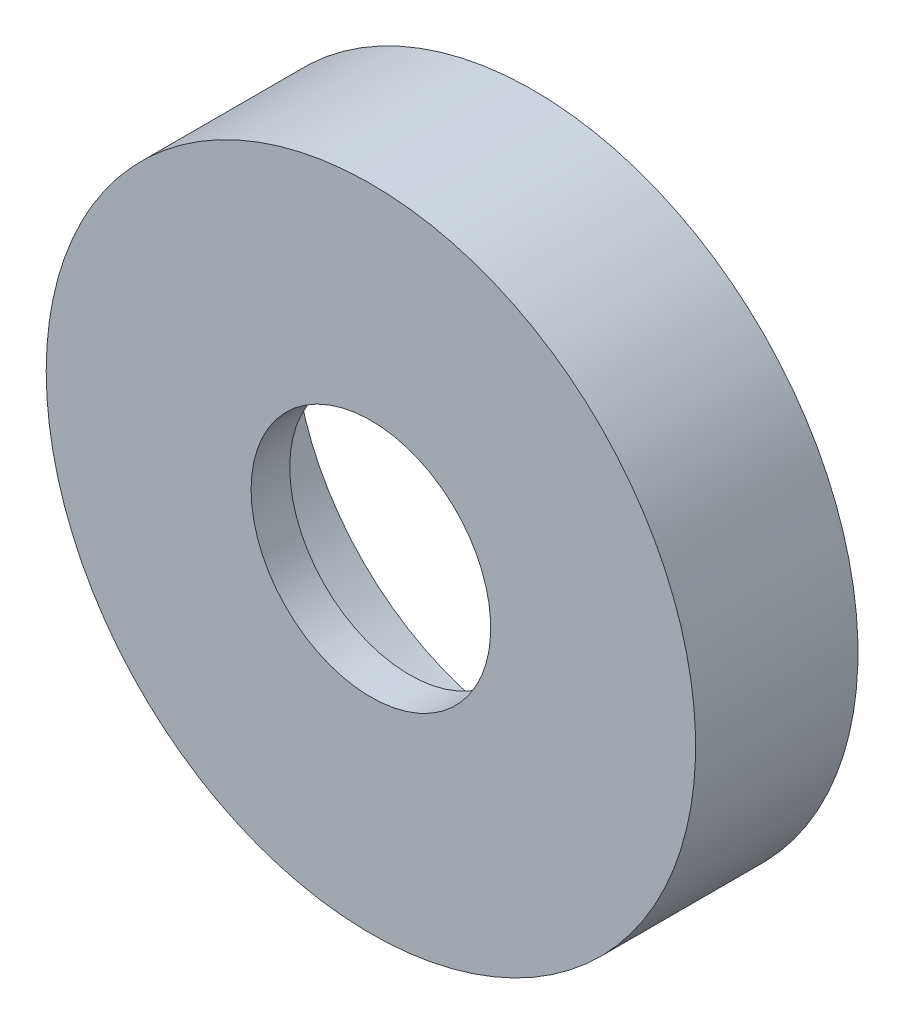
ISO-10303-21;
HEADER;
FILE_DESCRIPTION(('STEP AP214'),'2;1');
FILE_NAME('part.step','',(''),(''),'','','');
FILE_SCHEMA(('AUTOMOTIVE_DESIGN { 1 0 10303 214 1 1 1 1 }'));
ENDSEC;
DATA;
#1=APPLICATION_CONTEXT('core data for automotive mechanical design processes');
#2=APPLICATION_PROTOCOL_DEFINITION('international standard','automotive_design',2000,#1);
#3=PRODUCT_CONTEXT('',#1,'mechanical');
#4=PRODUCT('Part','Part','',(#3));
#5=PRODUCT_RELATED_PRODUCT_CATEGORY('part','',(#4));
#6=PRODUCT_DEFINITION_FORMATION('','',#4);
#7=PRODUCT_DEFINITION_CONTEXT('part definition',#1,'design');
#8=PRODUCT_DEFINITION('design','',#6,#7);
#9=PRODUCT_DEFINITION_SHAPE('','',#8);
#10=(LENGTH_UNIT() NAMED_UNIT(*) SI_UNIT(.MILLI.,.METRE.));
#11=(NAMED_UNIT(*) PLANE_ANGLE_UNIT() SI_UNIT($,.RADIAN.));
#12=(NAMED_UNIT(*) SI_UNIT($,.STERADIAN.) SOLID_ANGLE_UNIT());
#13=UNCERTAINTY_MEASURE_WITH_UNIT(LENGTH_MEASURE(1.E-05),#10,'distance_accuracy_value','');
#14=(GEOMETRIC_REPRESENTATION_CONTEXT(3) GLOBAL_UNCERTAINTY_ASSIGNED_CONTEXT((#13)) GLOBAL_UNIT_ASSIGNED_CONTEXT((#10,
#11,#12)) REPRESENTATION_CONTEXT('',''));
#15=CARTESIAN_POINT('',(0.,0.,0.));
#16=DIRECTION('',(0.,0.,1.));
#17=DIRECTION('',(1.,0.,0.));
#18=AXIS2_PLACEMENT_3D('',#15,#16,#17);
#19=CARTESIAN_POINT('',(0.,0.,21.));
#20=DIRECTION('',(0.,0.,-1.));
#21=DIRECTION('',(-1.,0.,0.));
#22=AXIS2_PLACEMENT_3D('',#19,#20,#21);
#23=CYLINDRICAL_SURFACE('',#22,42.);
#24=CARTESIAN_POINT('',(0.,0.,21.));
#25=DIRECTION('',(0.,0.,1.));
#26=DIRECTION('',(1.,0.,0.));
#27=AXIS2_PLACEMENT_3D('',#24,#25,#26);
#28=CIRCLE('',#27,42.);
#29=CARTESIAN_POINT('',(-42.,0.,21.));
#30=VERTEX_POINT('',#29);
#31=EDGE_CURVE('E10',#30,#30,#28,.T.);
#32=CARTESIAN_POINT('',(0.,0.,0.));
#33=DIRECTION('',(0.,0.,1.));
#34=DIRECTION('',(1.,0.,0.));
#35=AXIS2_PLACEMENT_3D('',#32,#33,#34);
#36=CIRCLE('',#35,42.);
#37=CARTESIAN_POINT('',(-42.,0.,0.));
#38=VERTEX_POINT('',#37);
#39=EDGE_CURVE('E32',#38,#38,#36,.T.);
#40=CARTESIAN_POINT('',(-42.,0.,21.));
#41=CARTESIAN_POINT('',(-42.,0.,20.78125));
#42=CARTESIAN_POINT('',(-42.,0.,20.5625));
#43=CARTESIAN_POINT('',(-42.,0.,20.125));
#44=CARTESIAN_POINT('',(-42.,0.,19.90625));
#45=CARTESIAN_POINT('',(-42.,0.,19.46875));
#46=CARTESIAN_POINT('',(-42.,0.,19.25));
#47=CARTESIAN_POINT('',(-42.,0.,18.8125));
#48=CARTESIAN_POINT('',(-42.,0.,18.59375));
#49=CARTESIAN_POINT('',(-42.,0.,18.15625));
#50=CARTESIAN_POINT('',(-42.,0.,17.9375));
#51=CARTESIAN_POINT('',(-42.,0.,17.5));
#52=CARTESIAN_POINT('',(-42.,0.,17.28125));
#53=CARTESIAN_POINT('',(-42.,0.,16.84375));
#54=CARTESIAN_POINT('',(-42.,0.,16.625));
#55=CARTESIAN_POINT('',(-42.,0.,16.1875));
#56=CARTESIAN_POINT('',(-42.,0.,15.96875));
#57=CARTESIAN_POINT('',(-42.,0.,15.53125));
#58=CARTESIAN_POINT('',(-42.,0.,15.3125));
#59=CARTESIAN_POINT('',(-42.,0.,14.875));
#60=CARTESIAN_POINT('',(-42.,0.,14.65625));
#61=CARTESIAN_POINT('',(-42.,0.,14.21875));
#62=CARTESIAN_POINT('',(-42.,0.,14.));
#63=CARTESIAN_POINT('',(-42.,0.,13.5625));
#64=CARTESIAN_POINT('',(-42.,0.,13.34375));
#65=CARTESIAN_POINT('',(-42.,0.,12.90625));
#66=CARTESIAN_POINT('',(-42.,0.,12.6875));
#67=CARTESIAN_POINT('',(-42.,0.,12.25));
#68=CARTESIAN_POINT('',(-42.,0.,12.03125));
#69=CARTESIAN_POINT('',(-42.,0.,11.59375));
#70=CARTESIAN_POINT('',(-42.,0.,11.375));
#71=CARTESIAN_POINT('',(-42.,0.,10.9375));
#72=CARTESIAN_POINT('',(-42.,0.,10.71875));
#73=CARTESIAN_POINT('',(-42.,0.,10.28125));
#74=CARTESIAN_POINT('',(-42.,0.,10.0625));
#75=CARTESIAN_POINT('',(-42.,0.,9.625));
#76=CARTESIAN_POINT('',(-42.,0.,9.40625));
#77=CARTESIAN_POINT('',(-42.,0.,8.96875));
#78=CARTESIAN_POINT('',(-42.,0.,8.75));
#79=CARTESIAN_POINT('',(-42.,0.,8.3125));
#80=CARTESIAN_POINT('',(-42.,0.,8.09375));
#81=CARTESIAN_POINT('',(-42.,0.,7.65625));
#82=CARTESIAN_POINT('',(-42.,0.,7.4375));
#83=CARTESIAN_POINT('',(-42.,0.,7.));
#84=CARTESIAN_POINT('',(-42.,0.,6.78125));
#85=CARTESIAN_POINT('',(-42.,0.,6.34375));
#86=CARTESIAN_POINT('',(-42.,0.,6.125));
#87=CARTESIAN_POINT('',(-42.,0.,5.6875));
#88=CARTESIAN_POINT('',(-42.,0.,5.46875));
#89=CARTESIAN_POINT('',(-42.,0.,5.03125));
#90=CARTESIAN_POINT('',(-42.,0.,4.8125));
#91=CARTESIAN_POINT('',(-42.,0.,4.375));
#92=CARTESIAN_POINT('',(-42.,0.,4.15625));
#93=CARTESIAN_POINT('',(-42.,0.,3.71875));
#94=CARTESIAN_POINT('',(-42.,0.,3.5));
#95=CARTESIAN_POINT('',(-42.,0.,3.0625));
#96=CARTESIAN_POINT('',(-42.,0.,2.84375));
#97=CARTESIAN_POINT('',(-42.,0.,2.40625));
#98=CARTESIAN_POINT('',(-42.,0.,2.1875));
#99=CARTESIAN_POINT('',(-42.,0.,1.75));
#100=CARTESIAN_POINT('',(-42.,0.,1.53125));
#101=CARTESIAN_POINT('',(-42.,0.,1.09375));
#102=CARTESIAN_POINT('',(-42.,0.,0.875000000000001));
#103=CARTESIAN_POINT('',(-42.,0.,0.4375));
#104=CARTESIAN_POINT('',(-42.,0.,0.21875));
#105=CARTESIAN_POINT('',(-42.,0.,0.));
#106=B_SPLINE_CURVE_WITH_KNOTS('',3,(#40,#41,#42,#43,#44,#45,#46,#47,#48,#49,#50,#51,#52,#53,
#54,#55,#56,#57,#58,#59,#60,#61,#62,#63,#64,#65,#66,#67,#68,#69,#70,#71,#72,#73,#74,#75,#76,#77,
#78,#79,#80,#81,#82,#83,#84,#85,#86,#87,#88,#89,#90,#91,#92,#93,#94,#95,#96,#97,#98,#99,#100,
#101,#102,#103,#104,#105),.UNSPECIFIED.,.F.,.F.,(4,2,2,2,2,2,2,2,2,2,2,2,2,2,2,2,2,2,2,2,2,2,2,
2,2,2,2,2,2,2,2,2,4),(0.,0.656250000000001,1.3125,1.96875,2.625,3.28125,3.9375,4.59375,5.25,
5.90625,6.5625,7.21875,7.875,8.53125,9.1875,9.84375,10.5,11.15625,11.8125,12.46875,13.125,
13.78125,14.4375,15.09375,15.75,16.40625,17.0625,17.71875,18.375,19.03125,19.6875,20.34375,21.),.UNSPECIFIED.);
#107=EDGE_CURVE('BSEAM29',#30,#38,#106,.T.);
#108=ORIENTED_EDGE('',*,*,#31,.F.);
#109=ORIENTED_EDGE('',*,*,#39,.T.);
#110=ORIENTED_EDGE('',*,*,#107,.T.);
#111=ORIENTED_EDGE('',*,*,#107,.F.);
#112=EDGE_LOOP('',(#108,#110,#109,#111));
#113=FACE_BOUND('',#112,.T.);
#114=ADVANCED_FACE('F29',(#113),#23,.T.);
#115=CARTESIAN_POINT('',(0.,0.,21.));
#116=DIRECTION('',(0.,0.,1.));
#117=DIRECTION('',(1.,0.,0.));
#118=AXIS2_PLACEMENT_3D('',#115,#116,#117);
#119=PLANE('',#118);
#120=CARTESIAN_POINT('',(0.,0.,21.));
#121=DIRECTION('',(0.,0.,-1.));
#122=DIRECTION('',(-1.,0.,0.));
#123=AXIS2_PLACEMENT_3D('',#120,#121,#122);
#124=CIRCLE('',#123,15.5);
#125=CARTESIAN_POINT('',(-15.5,0.,21.));
#126=VERTEX_POINT('',#125);
#127=EDGE_CURVE('E44',#126,#126,#124,.T.);
#128=ORIENTED_EDGE('',*,*,#127,.T.);
#129=EDGE_LOOP('',(#128));
#130=FACE_BOUND('',#129,.T.);
#131=ORIENTED_EDGE('',*,*,#31,.T.);
#132=EDGE_LOOP('',(#131));
#133=FACE_BOUND('',#132,.T.);
#134=ADVANCED_FACE('F53',(#130,#133),#119,.T.);
#135=CARTESIAN_POINT('',(0.,0.,0.));
#136=DIRECTION('',(0.,0.,1.));
#137=DIRECTION('',(1.,0.,0.));
#138=AXIS2_PLACEMENT_3D('',#135,#136,#137);
#139=PLANE('',#138);
#140=CARTESIAN_POINT('',(0.,0.,0.));
#141=DIRECTION('',(0.,0.,-1.));
#142=DIRECTION('',(-1.,0.,0.));
#143=AXIS2_PLACEMENT_3D('',#140,#141,#142);
#144=CIRCLE('',#143,31.);
#145=CARTESIAN_POINT('',(-31.,0.,0.));
#146=VERTEX_POINT('',#145);
#147=EDGE_CURVE('E41',#146,#146,#144,.T.);
#148=ORIENTED_EDGE('',*,*,#147,.F.);
#149=EDGE_LOOP('',(#148));
#150=FACE_BOUND('',#149,.T.);
#151=ORIENTED_EDGE('',*,*,#39,.F.);
#152=EDGE_LOOP('',(#151));
#153=FACE_BOUND('',#152,.T.);
#154=ADVANCED_FACE('F70',(#150,#153),#139,.F.);
#155=CARTESIAN_POINT('',(0.,0.,16.));
#156=DIRECTION('',(0.,0.,-1.));
#157=DIRECTION('',(-1.,0.,0.));
#158=AXIS2_PLACEMENT_3D('',#155,#156,#157);
#159=CYLINDRICAL_SURFACE('',#158,31.);
#160=CARTESIAN_POINT('',(0.,0.,16.));
#161=DIRECTION('',(0.,0.,-1.));
#162=DIRECTION('',(-1.,0.,0.));
#163=AXIS2_PLACEMENT_3D('',#160,#161,#162);
#164=CIRCLE('',#163,31.);
#165=CARTESIAN_POINT('',(-31.,0.,16.));
#166=VERTEX_POINT('',#165);
#167=EDGE_CURVE('E39',#166,#166,#164,.T.);
#168=ORIENTED_EDGE('',*,*,#167,.F.);
#169=EDGE_LOOP('',(#168));
#170=FACE_BOUND('',#169,.T.);
#171=ORIENTED_EDGE('',*,*,#147,.T.);
#172=EDGE_LOOP('',(#171));
#173=FACE_BOUND('',#172,.T.);
#174=ADVANCED_FACE('F64',(#170,#173),#159,.F.);
#175=CARTESIAN_POINT('',(0.,0.,16.));
#176=DIRECTION('',(0.,0.,-1.));
#177=DIRECTION('',(-1.,0.,0.));
#178=AXIS2_PLACEMENT_3D('',#175,#176,#177);
#179=PLANE('',#178);
#180=CARTESIAN_POINT('',(0.,0.,16.));
#181=DIRECTION('',(0.,0.,-1.));
#182=DIRECTION('',(-1.,0.,0.));
#183=AXIS2_PLACEMENT_3D('',#180,#181,#182);
#184=CIRCLE('',#183,15.5);
#185=CARTESIAN_POINT('',(-15.5,0.,16.));
#186=VERTEX_POINT('',#185);
#187=EDGE_CURVE('E47',#186,#186,#184,.T.);
#188=ORIENTED_EDGE('',*,*,#187,.F.);
#189=EDGE_LOOP('',(#188));
#190=FACE_BOUND('',#189,.T.);
#191=ORIENTED_EDGE('',*,*,#167,.T.);
#192=EDGE_LOOP('',(#191));
#193=FACE_BOUND('',#192,.T.);
#194=ADVANCED_FACE('F58',(#190,#193),#179,.T.);
#195=CARTESIAN_POINT('',(0.,0.,21.));
#196=DIRECTION('',(0.,0.,-1.));
#197=DIRECTION('',(-1.,0.,0.));
#198=AXIS2_PLACEMENT_3D('',#195,#196,#197);
#199=CYLINDRICAL_SURFACE('',#198,15.5);
#200=ORIENTED_EDGE('',*,*,#127,.F.);
#201=EDGE_LOOP('',(#200));
#202=FACE_BOUND('',#201,.T.);
#203=ORIENTED_EDGE('',*,*,#187,.T.);
#204=EDGE_LOOP('',(#203));
#205=FACE_BOUND('',#204,.T.);
#206=ADVANCED_FACE('F55',(#202,#205),#199,.F.);
#207=CLOSED_SHELL('',(#114,#134,#154,#174,#194,#206));
#208=MANIFOLD_SOLID_BREP('B2',#207);
#209=ADVANCED_BREP_SHAPE_REPRESENTATION('',(#18,#208),#14);
#210=SHAPE_DEFINITION_REPRESENTATION(#9,#209);
ENDSEC;
END-ISO-10303-21;
